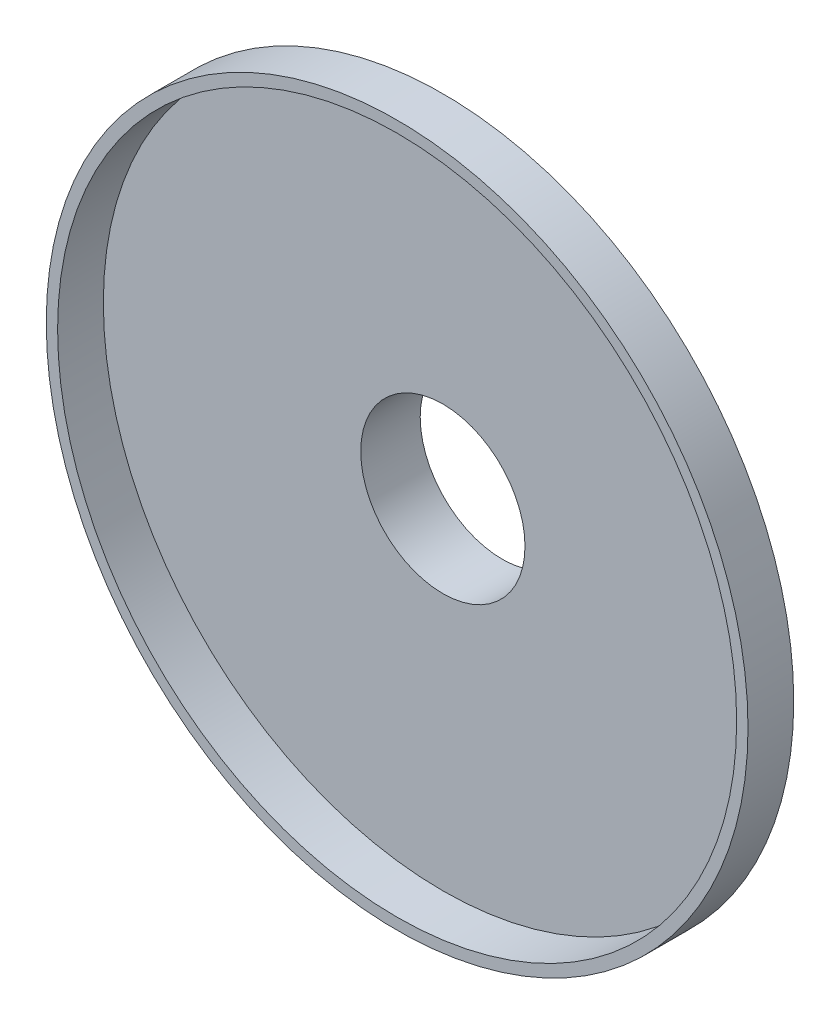
ISO-10303-21;
HEADER;
FILE_DESCRIPTION(('STEP AP214'),'2;1');
FILE_NAME('part.step','',(''),(''),'','','');
FILE_SCHEMA(('AUTOMOTIVE_DESIGN { 1 0 10303 214 1 1 1 1 }'));
ENDSEC;
DATA;
#1=APPLICATION_CONTEXT('core data for automotive mechanical design processes');
#2=APPLICATION_PROTOCOL_DEFINITION('international standard','automotive_design',2000,#1);
#3=PRODUCT_CONTEXT('',#1,'mechanical');
#4=PRODUCT('Part','Part','',(#3));
#5=PRODUCT_RELATED_PRODUCT_CATEGORY('part','',(#4));
#6=PRODUCT_DEFINITION_FORMATION('','',#4);
#7=PRODUCT_DEFINITION_CONTEXT('part definition',#1,'design');
#8=PRODUCT_DEFINITION('design','',#6,#7);
#9=PRODUCT_DEFINITION_SHAPE('','',#8);
#10=(LENGTH_UNIT() NAMED_UNIT(*) SI_UNIT(.MILLI.,.METRE.));
#11=(NAMED_UNIT(*) PLANE_ANGLE_UNIT() SI_UNIT($,.RADIAN.));
#12=(NAMED_UNIT(*) SI_UNIT($,.STERADIAN.) SOLID_ANGLE_UNIT());
#13=UNCERTAINTY_MEASURE_WITH_UNIT(LENGTH_MEASURE(1.E-05),#10,'distance_accuracy_value','');
#14=(GEOMETRIC_REPRESENTATION_CONTEXT(3) GLOBAL_UNCERTAINTY_ASSIGNED_CONTEXT((#13)) GLOBAL_UNIT_ASSIGNED_CONTEXT((#10,
#11,#12)) REPRESENTATION_CONTEXT('',''));
#15=CARTESIAN_POINT('',(0.,0.,0.));
#16=DIRECTION('',(0.,0.,1.));
#17=DIRECTION('',(1.,0.,0.));
#18=AXIS2_PLACEMENT_3D('',#15,#16,#17);
#19=CARTESIAN_POINT('',(0.,0.,-8.));
#20=DIRECTION('',(0.,0.,1.));
#21=DIRECTION('',(1.,0.,0.));
#22=AXIS2_PLACEMENT_3D('',#19,#20,#21);
#23=PLANE('',#22);
#24=CARTESIAN_POINT('',(0.,0.,-8.));
#25=DIRECTION('',(0.,0.,1.));
#26=DIRECTION('',(1.,0.,0.));
#27=AXIS2_PLACEMENT_3D('',#24,#25,#26);
#28=CIRCLE('',#27,54.7501806443628);
#29=CARTESIAN_POINT('',(54.7501806443628,0.,-8.));
#30=VERTEX_POINT('',#29);
#31=EDGE_CURVE('E39',#30,#30,#28,.T.);
#32=ORIENTED_EDGE('',*,*,#31,.F.);
#33=EDGE_LOOP('',(#32));
#34=FACE_BOUND('',#33,.T.);
#35=CARTESIAN_POINT('',(0.,0.,-8.));
#36=DIRECTION('',(0.,0.,1.));
#37=DIRECTION('',(1.,0.,0.));
#38=AXIS2_PLACEMENT_3D('',#35,#36,#37);
#39=CIRCLE('',#38,19.1695737193443);
#40=CARTESIAN_POINT('',(19.1695737193443,0.,-8.));
#41=VERTEX_POINT('',#40);
#42=EDGE_CURVE('E10',#41,#41,#39,.F.);
#43=ORIENTED_EDGE('',*,*,#42,.F.);
#44=EDGE_LOOP('',(#43));
#45=FACE_BOUND('',#44,.T.);
#46=ADVANCED_FACE('F32',(#34,#45),#23,.F.);
#47=CARTESIAN_POINT('',(0.,0.,60.788651665505));
#48=DIRECTION('',(0.,0.,-1.));
#49=DIRECTION('',(-1.,0.,0.));
#50=AXIS2_PLACEMENT_3D('',#47,#48,#49);
#51=CYLINDRICAL_SURFACE('',#50,17.9565);
#52=CARTESIAN_POINT('',(0.,0.,0.));
#53=DIRECTION('',(0.,0.,1.));
#54=DIRECTION('',(1.,0.,0.));
#55=AXIS2_PLACEMENT_3D('',#52,#53,#54);
#56=CIRCLE('',#55,17.9565);
#57=CARTESIAN_POINT('',(17.9565,0.,0.));
#58=VERTEX_POINT('',#57);
#59=EDGE_CURVE('E51',#58,#58,#56,.F.);
#60=ORIENTED_EDGE('',*,*,#59,.F.);
#61=EDGE_LOOP('',(#60));
#62=FACE_BOUND('',#61,.T.);
#63=CARTESIAN_POINT('',(0.,0.,-13.));
#64=DIRECTION('',(0.,0.,-1.));
#65=DIRECTION('',(-1.,0.,0.));
#66=AXIS2_PLACEMENT_3D('',#63,#64,#65);
#67=CIRCLE('',#66,17.9565);
#68=CARTESIAN_POINT('',(-17.9565,0.,-13.));
#69=VERTEX_POINT('',#68);
#70=EDGE_CURVE('E68',#69,#69,#67,.T.);
#71=ORIENTED_EDGE('',*,*,#70,.T.);
#72=EDGE_LOOP('',(#71));
#73=FACE_BOUND('',#72,.T.);
#74=ADVANCED_FACE('F72',(#62,#73),#51,.F.);
#75=CARTESIAN_POINT('',(0.,0.,0.));
#76=DIRECTION('',(0.,0.,1.));
#77=DIRECTION('',(1.,0.,0.));
#78=AXIS2_PLACEMENT_3D('',#75,#76,#77);
#79=CONICAL_SURFACE('',#78,76.73,1.22173047639603);
#80=ORIENTED_EDGE('',*,*,#31,.T.);
#81=EDGE_LOOP('',(#80));
#82=FACE_BOUND('',#81,.T.);
#83=CARTESIAN_POINT('',(0.,0.,0.));
#84=DIRECTION('',(0.,0.,1.));
#85=DIRECTION('',(1.,0.,0.));
#86=AXIS2_PLACEMENT_3D('',#83,#84,#85);
#87=CIRCLE('',#86,76.73);
#88=CARTESIAN_POINT('',(76.73,0.,0.));
#89=VERTEX_POINT('',#88);
#90=EDGE_CURVE('E43',#89,#89,#87,.T.);
#91=ORIENTED_EDGE('',*,*,#90,.F.);
#92=EDGE_LOOP('',(#91));
#93=FACE_BOUND('',#92,.T.);
#94=ADVANCED_FACE('F34',(#82,#93),#79,.T.);
#95=CARTESIAN_POINT('',(0.,0.,10.));
#96=DIRECTION('',(0.,0.,-1.));
#97=DIRECTION('',(-1.,0.,0.));
#98=AXIS2_PLACEMENT_3D('',#95,#96,#97);
#99=CYLINDRICAL_SURFACE('',#98,76.73);
#100=CARTESIAN_POINT('',(0.,0.,10.));
#101=DIRECTION('',(0.,0.,1.));
#102=DIRECTION('',(1.,0.,0.));
#103=AXIS2_PLACEMENT_3D('',#100,#101,#102);
#104=CIRCLE('',#103,76.73);
#105=CARTESIAN_POINT('',(76.73,0.,10.));
#106=VERTEX_POINT('',#105);
#107=EDGE_CURVE('E48',#106,#106,#104,.T.);
#108=ORIENTED_EDGE('',*,*,#107,.F.);
#109=EDGE_LOOP('',(#108));
#110=FACE_BOUND('',#109,.T.);
#111=ORIENTED_EDGE('',*,*,#90,.T.);
#112=EDGE_LOOP('',(#111));
#113=FACE_BOUND('',#112,.T.);
#114=ADVANCED_FACE('F98',(#110,#113),#99,.T.);
#115=CARTESIAN_POINT('',(0.,0.,10.));
#116=DIRECTION('',(0.,0.,1.));
#117=DIRECTION('',(1.,0.,0.));
#118=AXIS2_PLACEMENT_3D('',#115,#116,#117);
#119=PLANE('',#118);
#120=CARTESIAN_POINT('',(0.,0.,10.));
#121=DIRECTION('',(0.,0.,1.));
#122=DIRECTION('',(1.,0.,0.));
#123=AXIS2_PLACEMENT_3D('',#120,#121,#122);
#124=CIRCLE('',#123,74.2478493808279);
#125=CARTESIAN_POINT('',(74.2478493808279,0.,10.));
#126=VERTEX_POINT('',#125);
#127=EDGE_CURVE('E58',#126,#126,#124,.T.);
#128=ORIENTED_EDGE('',*,*,#127,.F.);
#129=EDGE_LOOP('',(#128));
#130=FACE_BOUND('',#129,.T.);
#131=ORIENTED_EDGE('',*,*,#107,.T.);
#132=EDGE_LOOP('',(#131));
#133=FACE_BOUND('',#132,.T.);
#134=ADVANCED_FACE('F101',(#130,#133),#119,.T.);
#135=CARTESIAN_POINT('',(0.,0.,0.));
#136=DIRECTION('',(0.,0.,1.));
#137=DIRECTION('',(1.,0.,0.));
#138=AXIS2_PLACEMENT_3D('',#135,#136,#137);
#139=PLANE('',#138);
#140=CARTESIAN_POINT('',(0.,0.,0.));
#141=DIRECTION('',(0.,0.,1.));
#142=DIRECTION('',(1.,0.,0.));
#143=AXIS2_PLACEMENT_3D('',#140,#141,#142);
#144=CIRCLE('',#143,74.2478493808279);
#145=CARTESIAN_POINT('',(74.2478493808279,0.,0.));
#146=VERTEX_POINT('',#145);
#147=EDGE_CURVE('E53',#146,#146,#144,.T.);
#148=ORIENTED_EDGE('',*,*,#147,.T.);
#149=EDGE_LOOP('',(#148));
#150=FACE_BOUND('',#149,.T.);
#151=ORIENTED_EDGE('',*,*,#59,.T.);
#152=EDGE_LOOP('',(#151));
#153=FACE_BOUND('',#152,.T.);
#154=ADVANCED_FACE('F86',(#150,#153),#139,.T.);
#155=CARTESIAN_POINT('',(0.,0.,0.));
#156=DIRECTION('',(0.,0.,1.));
#157=DIRECTION('',(1.,0.,0.));
#158=AXIS2_PLACEMENT_3D('',#155,#156,#157);
#159=CYLINDRICAL_SURFACE('',#158,74.2478493808279);
#160=ORIENTED_EDGE('',*,*,#147,.F.);
#161=EDGE_LOOP('',(#160));
#162=FACE_BOUND('',#161,.T.);
#163=ORIENTED_EDGE('',*,*,#127,.T.);
#164=EDGE_LOOP('',(#163));
#165=FACE_BOUND('',#164,.T.);
#166=ADVANCED_FACE('F77',(#162,#165),#159,.F.);
#167=CARTESIAN_POINT('',(0.,0.,-13.));
#168=DIRECTION('',(0.,0.,-1.));
#169=DIRECTION('',(-1.,0.,0.));
#170=AXIS2_PLACEMENT_3D('',#167,#168,#169);
#171=PLANE('',#170);
#172=CARTESIAN_POINT('',(0.,0.,-13.));
#173=DIRECTION('',(0.,0.,-1.));
#174=DIRECTION('',(-1.,0.,0.));
#175=AXIS2_PLACEMENT_3D('',#172,#173,#174);
#176=CIRCLE('',#175,19.1695737193443);
#177=CARTESIAN_POINT('',(-19.1695737193443,0.,-13.));
#178=VERTEX_POINT('',#177);
#179=EDGE_CURVE('E63',#178,#178,#176,.T.);
#180=ORIENTED_EDGE('',*,*,#179,.T.);
#181=EDGE_LOOP('',(#180));
#182=FACE_BOUND('',#181,.T.);
#183=ORIENTED_EDGE('',*,*,#70,.F.);
#184=EDGE_LOOP('',(#183));
#185=FACE_BOUND('',#184,.T.);
#186=ADVANCED_FACE('F74',(#182,#185),#171,.T.);
#187=CARTESIAN_POINT('',(0.,0.,-13.));
#188=DIRECTION('',(0.,0.,1.));
#189=DIRECTION('',(1.,0.,0.));
#190=AXIS2_PLACEMENT_3D('',#187,#188,#189);
#191=CYLINDRICAL_SURFACE('',#190,19.1695737193443);
#192=ORIENTED_EDGE('',*,*,#179,.F.);
#193=EDGE_LOOP('',(#192));
#194=FACE_BOUND('',#193,.T.);
#195=ORIENTED_EDGE('',*,*,#42,.T.);
#196=EDGE_LOOP('',(#195));
#197=FACE_BOUND('',#196,.T.);
#198=ADVANCED_FACE('F76',(#194,#197),#191,.T.);
#199=CLOSED_SHELL('',(#46,#74,#94,#114,#134,#154,#166,#186,#198));
#200=MANIFOLD_SOLID_BREP('B2',#199);
#201=ADVANCED_BREP_SHAPE_REPRESENTATION('',(#18,#200),#14);
#202=SHAPE_DEFINITION_REPRESENTATION(#9,#201);
ENDSEC;
END-ISO-10303-21;
